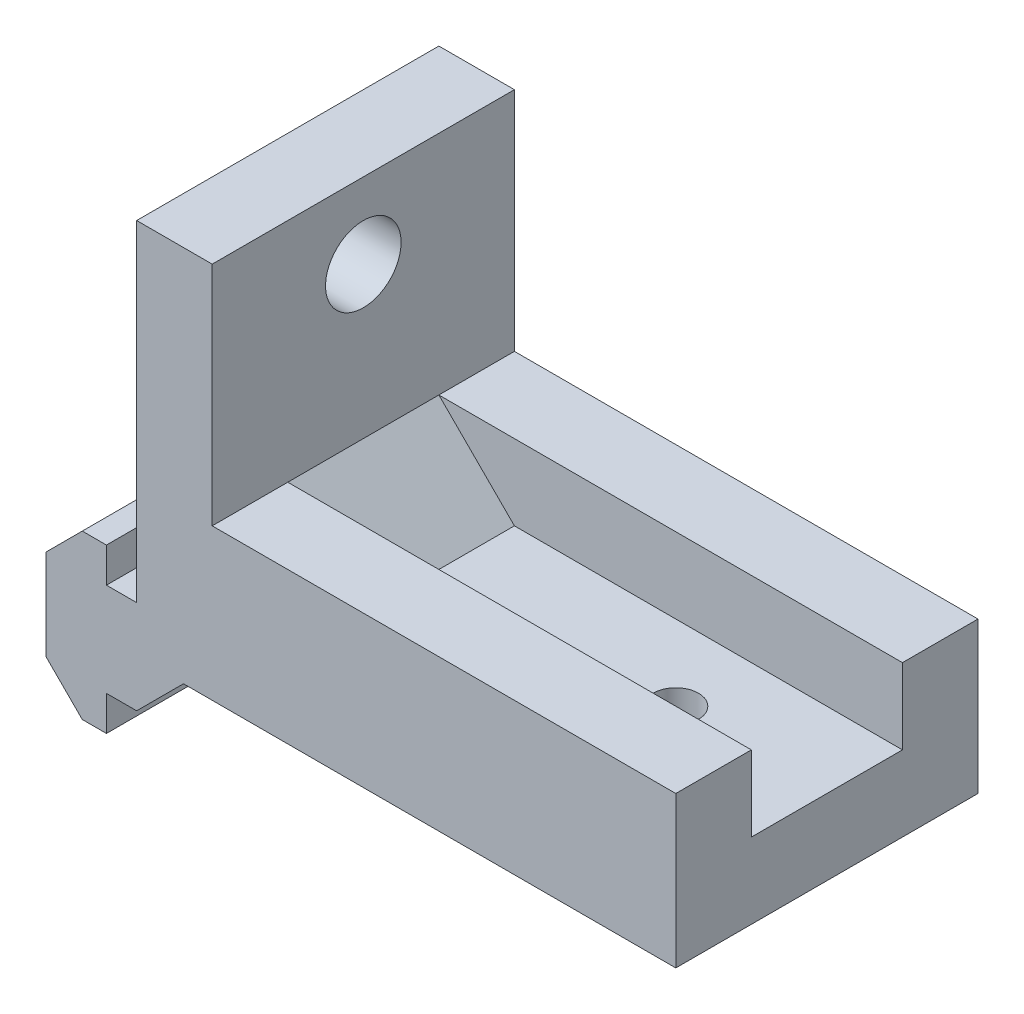
ISO-10303-21;
HEADER;
FILE_DESCRIPTION(('STEP AP214'),'2;1');
FILE_NAME('part.step','',(''),(''),'','','');
FILE_SCHEMA(('AUTOMOTIVE_DESIGN { 1 0 10303 214 1 1 1 1 }'));
ENDSEC;
DATA;
#1=APPLICATION_CONTEXT('core data for automotive mechanical design processes');
#2=APPLICATION_PROTOCOL_DEFINITION('international standard','automotive_design',2000,#1);
#3=PRODUCT_CONTEXT('',#1,'mechanical');
#4=PRODUCT('Part','Part','',(#3));
#5=PRODUCT_RELATED_PRODUCT_CATEGORY('part','',(#4));
#6=PRODUCT_DEFINITION_FORMATION('','',#4);
#7=PRODUCT_DEFINITION_CONTEXT('part definition',#1,'design');
#8=PRODUCT_DEFINITION('design','',#6,#7);
#9=PRODUCT_DEFINITION_SHAPE('','',#8);
#10=(LENGTH_UNIT() NAMED_UNIT(*) SI_UNIT(.MILLI.,.METRE.));
#11=(NAMED_UNIT(*) PLANE_ANGLE_UNIT() SI_UNIT($,.RADIAN.));
#12=(NAMED_UNIT(*) SI_UNIT($,.STERADIAN.) SOLID_ANGLE_UNIT());
#13=UNCERTAINTY_MEASURE_WITH_UNIT(LENGTH_MEASURE(1.E-05),#10,'distance_accuracy_value','');
#14=(GEOMETRIC_REPRESENTATION_CONTEXT(3) GLOBAL_UNCERTAINTY_ASSIGNED_CONTEXT((#13)) GLOBAL_UNIT_ASSIGNED_CONTEXT((#10,
#11,#12)) REPRESENTATION_CONTEXT('',''));
#15=CARTESIAN_POINT('',(0.,0.,0.));
#16=DIRECTION('',(0.,0.,1.));
#17=DIRECTION('',(1.,0.,0.));
#18=AXIS2_PLACEMENT_3D('',#15,#16,#17);
#19=CARTESIAN_POINT('',(0.,5.,0.));
#20=DIRECTION('',(1.,0.,0.));
#21=DIRECTION('',(0.,0.,-1.));
#22=AXIS2_PLACEMENT_3D('',#19,#20,#21);
#23=PLANE('',#22);
#24=CARTESIAN_POINT('',(0.,20.,0.));
#25=DIRECTION('',(1.,0.,0.));
#26=DIRECTION('',(0.,0.,-1.));
#27=AXIS2_PLACEMENT_3D('',#24,#25,#26);
#28=CIRCLE('',#27,2.5);
#29=CARTESIAN_POINT('',(0.,20.,-2.5));
#30=VERTEX_POINT('',#29);
#31=EDGE_CURVE('E260',#30,#30,#28,.T.);
#32=ORIENTED_EDGE('',*,*,#31,.T.);
#33=EDGE_LOOP('',(#32));
#34=FACE_BOUND('',#33,.T.);
#35=DIRECTION('',(0.,0.,-1.));
#36=VECTOR('',#35,1.);
#37=CARTESIAN_POINT('',(0.,3.1,22.3547561691844));
#38=LINE('',#37,#36);
#39=CARTESIAN_POINT('',(0.,3.1,10.));
#40=VERTEX_POINT('',#39);
#41=CARTESIAN_POINT('',(0.,3.1,-10.));
#42=VERTEX_POINT('',#41);
#43=EDGE_CURVE('E229',#40,#42,#38,.T.);
#44=ORIENTED_EDGE('',*,*,#43,.F.);
#45=DIRECTION('',(0.,-1.,0.));
#46=VECTOR('',#45,1.);
#47=CARTESIAN_POINT('',(0.,5.,10.));
#48=LINE('',#47,#46);
#49=CARTESIAN_POINT('',(0.,25.,10.));
#50=VERTEX_POINT('',#49);
#51=EDGE_CURVE('E480',#50,#40,#48,.T.);
#52=ORIENTED_EDGE('',*,*,#51,.F.);
#53=DIRECTION('',(0.,0.,1.));
#54=VECTOR('',#53,1.);
#55=CARTESIAN_POINT('',(0.,25.,0.));
#56=LINE('',#55,#54);
#57=CARTESIAN_POINT('',(0.,25.,-10.));
#58=VERTEX_POINT('',#57);
#59=EDGE_CURVE('E327',#58,#50,#56,.T.);
#60=ORIENTED_EDGE('',*,*,#59,.F.);
#61=DIRECTION('',(0.,-1.,0.));
#62=VECTOR('',#61,1.);
#63=CARTESIAN_POINT('',(0.,5.,-10.));
#64=LINE('',#63,#62);
#65=EDGE_CURVE('E484',#58,#42,#64,.T.);
#66=ORIENTED_EDGE('',*,*,#65,.T.);
#67=EDGE_LOOP('',(#44,#52,#60,#66));
#68=FACE_BOUND('',#67,.T.);
#69=ADVANCED_FACE('F43',(#34,#68),#23,.F.);
#70=CARTESIAN_POINT('',(0.,0.,0.));
#71=DIRECTION('',(0.,1.,0.));
#72=DIRECTION('',(0.,0.,1.));
#73=AXIS2_PLACEMENT_3D('',#70,#71,#72);
#74=PLANE('',#73);
#75=DIRECTION('',(-1.,0.,0.));
#76=VECTOR('',#75,1.);
#77=CARTESIAN_POINT('',(0.,0.,10.));
#78=LINE('',#77,#76);
#79=CARTESIAN_POINT('',(35.68,0.,10.));
#80=VERTEX_POINT('',#79);
#81=CARTESIAN_POINT('',(3.09999999999999,0.,10.));
#82=VERTEX_POINT('',#81);
#83=EDGE_CURVE('E468',#80,#82,#78,.T.);
#84=ORIENTED_EDGE('',*,*,#83,.T.);
#85=DIRECTION('',(0.,0.,-1.));
#86=VECTOR('',#85,1.);
#87=CARTESIAN_POINT('',(3.09999999999999,0.,-10.));
#88=LINE('',#87,#86);
#89=CARTESIAN_POINT('',(3.09999999999999,0.,-10.));
#90=VERTEX_POINT('',#89);
#91=EDGE_CURVE('E487',#82,#90,#88,.T.);
#92=ORIENTED_EDGE('',*,*,#91,.T.);
#93=DIRECTION('',(-1.,0.,0.));
#94=VECTOR('',#93,1.);
#95=CARTESIAN_POINT('',(0.,0.,-10.));
#96=LINE('',#95,#94);
#97=CARTESIAN_POINT('',(35.68,0.,-10.));
#98=VERTEX_POINT('',#97);
#99=EDGE_CURVE('E454',#98,#90,#96,.T.);
#100=ORIENTED_EDGE('',*,*,#99,.F.);
#101=DIRECTION('',(0.,0.,1.));
#102=VECTOR('',#101,1.);
#103=CARTESIAN_POINT('',(35.68,0.,0.));
#104=LINE('',#103,#102);
#105=EDGE_CURVE('E460',#98,#80,#104,.T.);
#106=ORIENTED_EDGE('',*,*,#105,.T.);
#107=EDGE_LOOP('',(#84,#92,#100,#106));
#108=FACE_BOUND('',#107,.T.);
#109=DIRECTION('',(1.,0.,0.));
#110=VECTOR('',#109,1.);
#111=CARTESIAN_POINT('',(0.,0.,2.75));
#112=LINE('',#111,#110);
#113=CARTESIAN_POINT('',(24.0922867597285,0.,2.75));
#114=VERTEX_POINT('',#113);
#115=CARTESIAN_POINT('',(27.2677132402715,0.,2.75));
#116=VERTEX_POINT('',#115);
#117=EDGE_CURVE('E342',#114,#116,#112,.T.);
#118=ORIENTED_EDGE('',*,*,#117,.T.);
#119=DIRECTION('',(0.5,0.,-0.866025403784439));
#120=VECTOR('',#119,1.);
#121=CARTESIAN_POINT('',(21.6415698604072,0.,12.4947661845922));
#122=LINE('',#121,#120);
#123=CARTESIAN_POINT('',(28.8554264805429,0.,0.));
#124=VERTEX_POINT('',#123);
#125=EDGE_CURVE('E371',#116,#124,#122,.T.);
#126=ORIENTED_EDGE('',*,*,#125,.T.);
#127=DIRECTION('',(-0.5,0.,-0.866025403784439));
#128=VECTOR('',#127,1.);
#129=CARTESIAN_POINT('',(21.6415698604072,0.,-12.4947661845922));
#130=LINE('',#129,#128);
#131=CARTESIAN_POINT('',(27.2677132402715,0.,-2.75));
#132=VERTEX_POINT('',#131);
#133=EDGE_CURVE('E375',#124,#132,#130,.T.);
#134=ORIENTED_EDGE('',*,*,#133,.T.);
#135=DIRECTION('',(-1.,0.,0.));
#136=VECTOR('',#135,1.);
#137=CARTESIAN_POINT('',(0.,0.,-2.75));
#138=LINE('',#137,#136);
#139=CARTESIAN_POINT('',(24.0922867597285,0.,-2.75));
#140=VERTEX_POINT('',#139);
#141=EDGE_CURVE('E379',#132,#140,#138,.T.);
#142=ORIENTED_EDGE('',*,*,#141,.T.);
#143=DIRECTION('',(-0.499999999999999,0.,0.866025403784439));
#144=VECTOR('',#143,1.);
#145=CARTESIAN_POINT('',(16.8784301395928,0.,9.74476618459219));
#146=LINE('',#145,#144);
#147=CARTESIAN_POINT('',(22.5045735194571,0.,0.));
#148=VERTEX_POINT('',#147);
#149=EDGE_CURVE('E383',#140,#148,#146,.T.);
#150=ORIENTED_EDGE('',*,*,#149,.T.);
#151=DIRECTION('',(0.5,0.,0.866025403784439));
#152=VECTOR('',#151,1.);
#153=CARTESIAN_POINT('',(16.8784301395928,0.,-9.74476618459219));
#154=LINE('',#153,#152);
#155=EDGE_CURVE('E348',#148,#114,#154,.T.);
#156=ORIENTED_EDGE('',*,*,#155,.T.);
#157=EDGE_LOOP('',(#118,#126,#134,#142,#150,#156));
#158=FACE_BOUND('',#157,.T.);
#159=ADVANCED_FACE('F532',(#108,#158),#74,.F.);
#160=CARTESIAN_POINT('',(0.,5.,0.));
#161=DIRECTION('',(0.,1.,0.));
#162=DIRECTION('',(0.,0.,1.));
#163=AXIS2_PLACEMENT_3D('',#160,#161,#162);
#164=PLANE('',#163);
#165=DIRECTION('',(1.,0.,0.));
#166=VECTOR('',#165,1.);
#167=CARTESIAN_POINT('',(0.,5.,-5.));
#168=LINE('',#167,#166);
#169=CARTESIAN_POINT('',(9.99999999999998,5.,-5.));
#170=VERTEX_POINT('',#169);
#171=CARTESIAN_POINT('',(35.68,5.,-5.));
#172=VERTEX_POINT('',#171);
#173=EDGE_CURVE('E451',#170,#172,#168,.T.);
#174=ORIENTED_EDGE('',*,*,#173,.F.);
#175=DIRECTION('',(0.,0.,1.));
#176=VECTOR('',#175,1.);
#177=CARTESIAN_POINT('',(9.99999999999999,5.,5.));
#178=LINE('',#177,#176);
#179=CARTESIAN_POINT('',(9.99999999999999,5.,5.));
#180=VERTEX_POINT('',#179);
#181=EDGE_CURVE('E53',#170,#180,#178,.T.);
#182=ORIENTED_EDGE('',*,*,#181,.T.);
#183=DIRECTION('',(1.,0.,0.));
#184=VECTOR('',#183,1.);
#185=CARTESIAN_POINT('',(0.,5.,5.));
#186=LINE('',#185,#184);
#187=CARTESIAN_POINT('',(35.68,5.,5.));
#188=VERTEX_POINT('',#187);
#189=EDGE_CURVE('E429',#180,#188,#186,.T.);
#190=ORIENTED_EDGE('',*,*,#189,.T.);
#191=DIRECTION('',(0.,0.,1.));
#192=VECTOR('',#191,1.);
#193=CARTESIAN_POINT('',(35.68,5.,0.));
#194=LINE('',#193,#192);
#195=EDGE_CURVE('E455',#172,#188,#194,.T.);
#196=ORIENTED_EDGE('',*,*,#195,.F.);
#197=EDGE_LOOP('',(#174,#182,#190,#196));
#198=FACE_BOUND('',#197,.T.);
#199=CARTESIAN_POINT('',(25.68,5.,0.));
#200=DIRECTION('',(0.,1.,0.));
#201=DIRECTION('',(0.,0.,1.));
#202=AXIS2_PLACEMENT_3D('',#199,#200,#201);
#203=CIRCLE('',#202,1.5);
#204=CARTESIAN_POINT('',(25.68,5.,1.5));
#205=VERTEX_POINT('',#204);
#206=EDGE_CURVE('E459',#205,#205,#203,.T.);
#207=ORIENTED_EDGE('',*,*,#206,.F.);
#208=EDGE_LOOP('',(#207));
#209=FACE_BOUND('',#208,.T.);
#210=ADVANCED_FACE('F517',(#198,#209),#164,.T.);
#211=CARTESIAN_POINT('',(0.,5.,-10.));
#212=DIRECTION('',(0.,0.,1.));
#213=DIRECTION('',(1.,0.,0.));
#214=AXIS2_PLACEMENT_3D('',#211,#212,#213);
#215=PLANE('',#214);
#216=ORIENTED_EDGE('',*,*,#65,.F.);
#217=DIRECTION('',(-1.,0.,0.));
#218=VECTOR('',#217,1.);
#219=CARTESIAN_POINT('',(0.,25.,-10.));
#220=LINE('',#219,#218);
#221=CARTESIAN_POINT('',(5.,25.,-10.));
#222=VERTEX_POINT('',#221);
#223=EDGE_CURVE('E323',#222,#58,#220,.T.);
#224=ORIENTED_EDGE('',*,*,#223,.F.);
#225=DIRECTION('',(0.,-1.,0.));
#226=VECTOR('',#225,1.);
#227=CARTESIAN_POINT('',(5.,25.,-10.));
#228=LINE('',#227,#226);
#229=CARTESIAN_POINT('',(5.,10.,-10.));
#230=VERTEX_POINT('',#229);
#231=EDGE_CURVE('E338',#222,#230,#228,.T.);
#232=ORIENTED_EDGE('',*,*,#231,.T.);
#233=DIRECTION('',(-1.,0.,0.));
#234=VECTOR('',#233,1.);
#235=CARTESIAN_POINT('',(0.,10.,-10.));
#236=LINE('',#235,#234);
#237=CARTESIAN_POINT('',(35.68,10.,-10.));
#238=VERTEX_POINT('',#237);
#239=EDGE_CURVE('E439',#238,#230,#236,.T.);
#240=ORIENTED_EDGE('',*,*,#239,.F.);
#241=DIRECTION('',(0.,-1.,0.));
#242=VECTOR('',#241,1.);
#243=CARTESIAN_POINT('',(35.68,5.,-10.));
#244=LINE('',#243,#242);
#245=EDGE_CURVE('E464',#238,#98,#244,.T.);
#246=ORIENTED_EDGE('',*,*,#245,.T.);
#247=ORIENTED_EDGE('',*,*,#99,.T.);
#248=DIRECTION('',(0.707106781186547,0.707106781186548,0.));
#249=VECTOR('',#248,1.);
#250=CARTESIAN_POINT('',(4.05,0.950000000000012,-10.));
#251=LINE('',#250,#249);
#252=CARTESIAN_POINT('',(0.,-3.1,-10.));
#253=VERTEX_POINT('',#252);
#254=EDGE_CURVE('E493',#90,#253,#251,.F.);
#255=ORIENTED_EDGE('',*,*,#254,.T.);
#256=DIRECTION('',(-1.,0.,0.));
#257=VECTOR('',#256,1.);
#258=CARTESIAN_POINT('',(-2.,-3.1,-10.));
#259=LINE('',#258,#257);
#260=CARTESIAN_POINT('',(-2.,-3.1,-10.));
#261=VERTEX_POINT('',#260);
#262=EDGE_CURVE('E245',#253,#261,#259,.T.);
#263=ORIENTED_EDGE('',*,*,#262,.T.);
#264=DIRECTION('',(0.,-1.,0.));
#265=VECTOR('',#264,1.);
#266=CARTESIAN_POINT('',(-2.,-5.4,-10.));
#267=LINE('',#266,#265);
#268=CARTESIAN_POINT('',(-2.,-5.4,-10.));
#269=VERTEX_POINT('',#268);
#270=EDGE_CURVE('E252',#261,#269,#267,.T.);
#271=ORIENTED_EDGE('',*,*,#270,.T.);
#272=DIRECTION('',(-1.,0.,0.));
#273=VECTOR('',#272,1.);
#274=CARTESIAN_POINT('',(-3.6,-5.4,-10.));
#275=LINE('',#274,#273);
#276=CARTESIAN_POINT('',(-3.6,-5.4,-10.));
#277=VERTEX_POINT('',#276);
#278=EDGE_CURVE('E551',#269,#277,#275,.T.);
#279=ORIENTED_EDGE('',*,*,#278,.T.);
#280=DIRECTION('',(-0.707106781186548,0.707106781186548,0.));
#281=VECTOR('',#280,1.);
#282=CARTESIAN_POINT('',(-6.,-3.,-10.));
#283=LINE('',#282,#281);
#284=CARTESIAN_POINT('',(-6.,-3.,-10.));
#285=VERTEX_POINT('',#284);
#286=EDGE_CURVE('E553',#277,#285,#283,.T.);
#287=ORIENTED_EDGE('',*,*,#286,.T.);
#288=DIRECTION('',(0.,1.,0.));
#289=VECTOR('',#288,1.);
#290=CARTESIAN_POINT('',(-6.,3.,-10.));
#291=LINE('',#290,#289);
#292=CARTESIAN_POINT('',(-6.,3.,-10.));
#293=VERTEX_POINT('',#292);
#294=EDGE_CURVE('E559',#285,#293,#291,.T.);
#295=ORIENTED_EDGE('',*,*,#294,.T.);
#296=DIRECTION('',(0.707106781186548,0.707106781186548,0.));
#297=VECTOR('',#296,1.);
#298=CARTESIAN_POINT('',(-3.6,5.4,-10.));
#299=LINE('',#298,#297);
#300=CARTESIAN_POINT('',(-3.6,5.4,-10.));
#301=VERTEX_POINT('',#300);
#302=EDGE_CURVE('E563',#293,#301,#299,.T.);
#303=ORIENTED_EDGE('',*,*,#302,.T.);
#304=DIRECTION('',(1.,0.,0.));
#305=VECTOR('',#304,1.);
#306=CARTESIAN_POINT('',(-2.,5.4,-10.));
#307=LINE('',#306,#305);
#308=CARTESIAN_POINT('',(-2.,5.4,-10.));
#309=VERTEX_POINT('',#308);
#310=EDGE_CURVE('E238',#301,#309,#307,.T.);
#311=ORIENTED_EDGE('',*,*,#310,.T.);
#312=DIRECTION('',(0.,-1.,0.));
#313=VECTOR('',#312,1.);
#314=CARTESIAN_POINT('',(-2.,3.1,-10.));
#315=LINE('',#314,#313);
#316=CARTESIAN_POINT('',(-2.,3.1,-10.));
#317=VERTEX_POINT('',#316);
#318=EDGE_CURVE('E220',#309,#317,#315,.T.);
#319=ORIENTED_EDGE('',*,*,#318,.T.);
#320=DIRECTION('',(1.,0.,0.));
#321=VECTOR('',#320,1.);
#322=CARTESIAN_POINT('',(0.,3.1,-10.));
#323=LINE('',#322,#321);
#324=EDGE_CURVE('E235',#317,#42,#323,.T.);
#325=ORIENTED_EDGE('',*,*,#324,.T.);
#326=EDGE_LOOP('',(#216,#224,#232,#240,#246,#247,#255,#263,#271,#279,#287,#295,#303,#311,#319,#325));
#327=FACE_BOUND('',#326,.T.);
#328=ADVANCED_FACE('F234',(#327),#215,.F.);
#329=CARTESIAN_POINT('',(0.,5.,10.));
#330=DIRECTION('',(0.,0.,1.));
#331=DIRECTION('',(1.,0.,0.));
#332=AXIS2_PLACEMENT_3D('',#329,#330,#331);
#333=PLANE('',#332);
#334=DIRECTION('',(-1.,0.,0.));
#335=VECTOR('',#334,1.);
#336=CARTESIAN_POINT('',(0.,25.,10.));
#337=LINE('',#336,#335);
#338=CARTESIAN_POINT('',(5.,25.,10.));
#339=VERTEX_POINT('',#338);
#340=EDGE_CURVE('E331',#339,#50,#337,.T.);
#341=ORIENTED_EDGE('',*,*,#340,.T.);
#342=ORIENTED_EDGE('',*,*,#51,.T.);
#343=DIRECTION('',(-1.,0.,0.));
#344=VECTOR('',#343,1.);
#345=CARTESIAN_POINT('',(0.,3.1,10.));
#346=LINE('',#345,#344);
#347=CARTESIAN_POINT('',(-2.,3.1,10.));
#348=VERTEX_POINT('',#347);
#349=EDGE_CURVE('E283',#40,#348,#346,.T.);
#350=ORIENTED_EDGE('',*,*,#349,.T.);
#351=DIRECTION('',(0.,1.,0.));
#352=VECTOR('',#351,1.);
#353=CARTESIAN_POINT('',(-2.,3.1,10.));
#354=LINE('',#353,#352);
#355=CARTESIAN_POINT('',(-2.,5.4,10.));
#356=VERTEX_POINT('',#355);
#357=EDGE_CURVE('E222',#348,#356,#354,.T.);
#358=ORIENTED_EDGE('',*,*,#357,.T.);
#359=DIRECTION('',(-1.,0.,0.));
#360=VECTOR('',#359,1.);
#361=CARTESIAN_POINT('',(-2.,5.4,10.));
#362=LINE('',#361,#360);
#363=CARTESIAN_POINT('',(-3.6,5.4,10.));
#364=VERTEX_POINT('',#363);
#365=EDGE_CURVE('E277',#356,#364,#362,.T.);
#366=ORIENTED_EDGE('',*,*,#365,.T.);
#367=DIRECTION('',(-0.707106781186548,-0.707106781186548,0.));
#368=VECTOR('',#367,1.);
#369=CARTESIAN_POINT('',(-3.6,5.4,10.));
#370=LINE('',#369,#368);
#371=CARTESIAN_POINT('',(-6.,3.,10.));
#372=VERTEX_POINT('',#371);
#373=EDGE_CURVE('E273',#364,#372,#370,.T.);
#374=ORIENTED_EDGE('',*,*,#373,.T.);
#375=DIRECTION('',(0.,-1.,0.));
#376=VECTOR('',#375,1.);
#377=CARTESIAN_POINT('',(-6.,3.,10.));
#378=LINE('',#377,#376);
#379=CARTESIAN_POINT('',(-6.,-3.,10.));
#380=VERTEX_POINT('',#379);
#381=EDGE_CURVE('E269',#372,#380,#378,.T.);
#382=ORIENTED_EDGE('',*,*,#381,.T.);
#383=DIRECTION('',(0.707106781186548,-0.707106781186548,0.));
#384=VECTOR('',#383,1.);
#385=CARTESIAN_POINT('',(-6.,-3.,10.));
#386=LINE('',#385,#384);
#387=CARTESIAN_POINT('',(-3.6,-5.4,10.));
#388=VERTEX_POINT('',#387);
#389=EDGE_CURVE('E265',#380,#388,#386,.T.);
#390=ORIENTED_EDGE('',*,*,#389,.T.);
#391=DIRECTION('',(1.,0.,0.));
#392=VECTOR('',#391,1.);
#393=CARTESIAN_POINT('',(-3.6,-5.4,10.));
#394=LINE('',#393,#392);
#395=CARTESIAN_POINT('',(-2.,-5.4,10.));
#396=VERTEX_POINT('',#395);
#397=EDGE_CURVE('E261',#388,#396,#394,.T.);
#398=ORIENTED_EDGE('',*,*,#397,.T.);
#399=DIRECTION('',(0.,1.,0.));
#400=VECTOR('',#399,1.);
#401=CARTESIAN_POINT('',(-2.,-5.4,10.));
#402=LINE('',#401,#400);
#403=CARTESIAN_POINT('',(-2.,-3.1,10.));
#404=VERTEX_POINT('',#403);
#405=EDGE_CURVE('E256',#396,#404,#402,.T.);
#406=ORIENTED_EDGE('',*,*,#405,.T.);
#407=DIRECTION('',(1.,0.,0.));
#408=VECTOR('',#407,1.);
#409=CARTESIAN_POINT('',(-2.,-3.1,10.));
#410=LINE('',#409,#408);
#411=CARTESIAN_POINT('',(0.,-3.1,10.));
#412=VERTEX_POINT('',#411);
#413=EDGE_CURVE('E286',#404,#412,#410,.T.);
#414=ORIENTED_EDGE('',*,*,#413,.T.);
#415=DIRECTION('',(-0.707106781186547,-0.707106781186548,0.));
#416=VECTOR('',#415,1.);
#417=CARTESIAN_POINT('',(0.,-3.1,10.));
#418=LINE('',#417,#416);
#419=EDGE_CURVE('E490',#412,#82,#418,.F.);
#420=ORIENTED_EDGE('',*,*,#419,.T.);
#421=ORIENTED_EDGE('',*,*,#83,.F.);
#422=DIRECTION('',(0.,-1.,0.));
#423=VECTOR('',#422,1.);
#424=CARTESIAN_POINT('',(35.68,5.,10.));
#425=LINE('',#424,#423);
#426=CARTESIAN_POINT('',(35.68,10.,10.));
#427=VERTEX_POINT('',#426);
#428=EDGE_CURVE('E476',#427,#80,#425,.T.);
#429=ORIENTED_EDGE('',*,*,#428,.F.);
#430=DIRECTION('',(-1.,0.,0.));
#431=VECTOR('',#430,1.);
#432=CARTESIAN_POINT('',(0.,10.,10.));
#433=LINE('',#432,#431);
#434=CARTESIAN_POINT('',(5.,10.,10.));
#435=VERTEX_POINT('',#434);
#436=EDGE_CURVE('E417',#427,#435,#433,.T.);
#437=ORIENTED_EDGE('',*,*,#436,.T.);
#438=DIRECTION('',(0.,-1.,0.));
#439=VECTOR('',#438,1.);
#440=CARTESIAN_POINT('',(5.,25.,10.));
#441=LINE('',#440,#439);
#442=EDGE_CURVE('E335',#339,#435,#441,.T.);
#443=ORIENTED_EDGE('',*,*,#442,.F.);
#444=EDGE_LOOP('',(#341,#342,#350,#358,#366,#374,#382,#390,#398,#406,#414,#420,#421,#429,#437,#443));
#445=FACE_BOUND('',#444,.T.);
#446=ADVANCED_FACE('F529',(#445),#333,.T.);
#447=CARTESIAN_POINT('',(35.68,5.,0.));
#448=DIRECTION('',(1.,0.,0.));
#449=DIRECTION('',(0.,0.,-1.));
#450=AXIS2_PLACEMENT_3D('',#447,#448,#449);
#451=PLANE('',#450);
#452=ORIENTED_EDGE('',*,*,#428,.T.);
#453=ORIENTED_EDGE('',*,*,#105,.F.);
#454=ORIENTED_EDGE('',*,*,#245,.F.);
#455=DIRECTION('',(0.,0.,1.));
#456=VECTOR('',#455,1.);
#457=CARTESIAN_POINT('',(35.68,10.,0.));
#458=LINE('',#457,#456);
#459=CARTESIAN_POINT('',(35.68,10.,-5.));
#460=VERTEX_POINT('',#459);
#461=EDGE_CURVE('E435',#238,#460,#458,.T.);
#462=ORIENTED_EDGE('',*,*,#461,.T.);
#463=DIRECTION('',(0.,-1.,0.));
#464=VECTOR('',#463,1.);
#465=CARTESIAN_POINT('',(35.68,10.,-5.));
#466=LINE('',#465,#464);
#467=EDGE_CURVE('E447',#460,#172,#466,.T.);
#468=ORIENTED_EDGE('',*,*,#467,.T.);
#469=ORIENTED_EDGE('',*,*,#195,.T.);
#470=DIRECTION('',(0.,-1.,0.));
#471=VECTOR('',#470,1.);
#472=CARTESIAN_POINT('',(35.68,10.,5.));
#473=LINE('',#472,#471);
#474=CARTESIAN_POINT('',(35.68,10.,5.));
#475=VERTEX_POINT('',#474);
#476=EDGE_CURVE('E425',#475,#188,#473,.T.);
#477=ORIENTED_EDGE('',*,*,#476,.F.);
#478=DIRECTION('',(0.,0.,1.));
#479=VECTOR('',#478,1.);
#480=CARTESIAN_POINT('',(35.68,10.,0.));
#481=LINE('',#480,#479);
#482=EDGE_CURVE('E421',#475,#427,#481,.T.);
#483=ORIENTED_EDGE('',*,*,#482,.T.);
#484=EDGE_LOOP('',(#452,#453,#454,#462,#468,#469,#477,#483));
#485=FACE_BOUND('',#484,.T.);
#486=ADVANCED_FACE('F516',(#485),#451,.T.);
#487=CARTESIAN_POINT('',(25.68,5.,0.));
#488=DIRECTION('',(0.,-1.,0.));
#489=DIRECTION('',(0.,0.,-1.));
#490=AXIS2_PLACEMENT_3D('',#487,#488,#489);
#491=CYLINDRICAL_SURFACE('',#490,1.5);
#492=CARTESIAN_POINT('',(25.68,1.5,0.));
#493=DIRECTION('',(0.,1.,0.));
#494=DIRECTION('',(0.,0.,1.));
#495=AXIS2_PLACEMENT_3D('',#492,#493,#494);
#496=CIRCLE('',#495,1.5);
#497=CARTESIAN_POINT('',(25.68,1.5,1.5));
#498=VERTEX_POINT('',#497);
#499=EDGE_CURVE('E343',#498,#498,#496,.T.);
#500=ORIENTED_EDGE('',*,*,#499,.F.);
#501=EDGE_LOOP('',(#500));
#502=FACE_BOUND('',#501,.T.);
#503=ORIENTED_EDGE('',*,*,#206,.T.);
#504=EDGE_LOOP('',(#503));
#505=FACE_BOUND('',#504,.T.);
#506=ADVANCED_FACE('F723',(#502,#505),#491,.F.);
#507=CARTESIAN_POINT('',(0.,10.,-5.));
#508=DIRECTION('',(0.,0.,1.));
#509=DIRECTION('',(1.,0.,0.));
#510=AXIS2_PLACEMENT_3D('',#507,#508,#509);
#511=PLANE('',#510);
#512=DIRECTION('',(-1.,0.,0.));
#513=VECTOR('',#512,1.);
#514=CARTESIAN_POINT('',(0.,10.,-5.));
#515=LINE('',#514,#513);
#516=CARTESIAN_POINT('',(5.,10.,-5.));
#517=VERTEX_POINT('',#516);
#518=EDGE_CURVE('E432',#460,#517,#515,.T.);
#519=ORIENTED_EDGE('',*,*,#518,.T.);
#520=DIRECTION('',(-0.707106781186544,0.707106781186551,0.));
#521=VECTOR('',#520,1.);
#522=CARTESIAN_POINT('',(2.50000000000004,12.5,-5.));
#523=LINE('',#522,#521);
#524=EDGE_CURVE('E67',#517,#170,#523,.F.);
#525=ORIENTED_EDGE('',*,*,#524,.T.);
#526=ORIENTED_EDGE('',*,*,#173,.T.);
#527=ORIENTED_EDGE('',*,*,#467,.F.);
#528=EDGE_LOOP('',(#519,#525,#526,#527));
#529=FACE_BOUND('',#528,.T.);
#530=ADVANCED_FACE('F513',(#529),#511,.T.);
#531=CARTESIAN_POINT('',(0.,10.,0.));
#532=DIRECTION('',(0.,1.,0.));
#533=DIRECTION('',(0.,0.,1.));
#534=AXIS2_PLACEMENT_3D('',#531,#532,#533);
#535=PLANE('',#534);
#536=ORIENTED_EDGE('',*,*,#518,.F.);
#537=ORIENTED_EDGE('',*,*,#461,.F.);
#538=ORIENTED_EDGE('',*,*,#239,.T.);
#539=DIRECTION('',(0.,0.,1.));
#540=VECTOR('',#539,1.);
#541=CARTESIAN_POINT('',(5.,10.,0.));
#542=LINE('',#541,#540);
#543=EDGE_CURVE('E443',#230,#517,#542,.T.);
#544=ORIENTED_EDGE('',*,*,#543,.T.);
#545=EDGE_LOOP('',(#536,#537,#538,#544));
#546=FACE_BOUND('',#545,.T.);
#547=ADVANCED_FACE('F510',(#546),#535,.T.);
#548=CARTESIAN_POINT('',(0.,10.,5.));
#549=DIRECTION('',(0.,0.,1.));
#550=DIRECTION('',(1.,0.,0.));
#551=AXIS2_PLACEMENT_3D('',#548,#549,#550);
#552=PLANE('',#551);
#553=ORIENTED_EDGE('',*,*,#189,.F.);
#554=DIRECTION('',(0.707106781186544,-0.707106781186551,0.));
#555=VECTOR('',#554,1.);
#556=CARTESIAN_POINT('',(5.,10.,5.));
#557=LINE('',#556,#555);
#558=CARTESIAN_POINT('',(5.,10.,5.));
#559=VERTEX_POINT('',#558);
#560=EDGE_CURVE('E11',#180,#559,#557,.F.);
#561=ORIENTED_EDGE('',*,*,#560,.T.);
#562=DIRECTION('',(-1.,0.,0.));
#563=VECTOR('',#562,1.);
#564=CARTESIAN_POINT('',(0.,10.,5.));
#565=LINE('',#564,#563);
#566=EDGE_CURVE('E409',#475,#559,#565,.T.);
#567=ORIENTED_EDGE('',*,*,#566,.F.);
#568=ORIENTED_EDGE('',*,*,#476,.T.);
#569=EDGE_LOOP('',(#553,#561,#567,#568));
#570=FACE_BOUND('',#569,.T.);
#571=ADVANCED_FACE('F521',(#570),#552,.F.);
#572=CARTESIAN_POINT('',(0.,10.,0.));
#573=DIRECTION('',(0.,1.,0.));
#574=DIRECTION('',(0.,0.,1.));
#575=AXIS2_PLACEMENT_3D('',#572,#573,#574);
#576=PLANE('',#575);
#577=ORIENTED_EDGE('',*,*,#566,.T.);
#578=DIRECTION('',(0.,0.,1.));
#579=VECTOR('',#578,1.);
#580=CARTESIAN_POINT('',(5.,10.,0.));
#581=LINE('',#580,#579);
#582=EDGE_CURVE('E413',#559,#435,#581,.T.);
#583=ORIENTED_EDGE('',*,*,#582,.T.);
#584=ORIENTED_EDGE('',*,*,#436,.F.);
#585=ORIENTED_EDGE('',*,*,#482,.F.);
#586=EDGE_LOOP('',(#577,#583,#584,#585));
#587=FACE_BOUND('',#586,.T.);
#588=ADVANCED_FACE('F527',(#587),#576,.T.);
#589=CARTESIAN_POINT('',(0.,1.5,2.75));
#590=DIRECTION('',(0.,0.,-1.));
#591=DIRECTION('',(-1.,0.,0.));
#592=AXIS2_PLACEMENT_3D('',#589,#590,#591);
#593=PLANE('',#592);
#594=ORIENTED_EDGE('',*,*,#117,.F.);
#595=DIRECTION('',(0.,-1.,0.));
#596=VECTOR('',#595,1.);
#597=CARTESIAN_POINT('',(24.0922867597285,1.5,2.75));
#598=LINE('',#597,#596);
#599=CARTESIAN_POINT('',(24.0922867597285,1.5,2.75));
#600=VERTEX_POINT('',#599);
#601=EDGE_CURVE('E367',#600,#114,#598,.T.);
#602=ORIENTED_EDGE('',*,*,#601,.F.);
#603=DIRECTION('',(1.,0.,0.));
#604=VECTOR('',#603,1.);
#605=CARTESIAN_POINT('',(0.,1.5,2.75));
#606=LINE('',#605,#604);
#607=CARTESIAN_POINT('',(27.2677132402715,1.5,2.75));
#608=VERTEX_POINT('',#607);
#609=EDGE_CURVE('E347',#600,#608,#606,.T.);
#610=ORIENTED_EDGE('',*,*,#609,.T.);
#611=DIRECTION('',(0.,-1.,0.));
#612=VECTOR('',#611,1.);
#613=CARTESIAN_POINT('',(27.2677132402715,1.5,2.75));
#614=LINE('',#613,#612);
#615=EDGE_CURVE('E405',#608,#116,#614,.T.);
#616=ORIENTED_EDGE('',*,*,#615,.T.);
#617=EDGE_LOOP('',(#594,#602,#610,#616));
#618=FACE_BOUND('',#617,.T.);
#619=ADVANCED_FACE('F751',(#618),#593,.T.);
#620=CARTESIAN_POINT('',(21.6415698604072,1.5,12.4947661845922));
#621=DIRECTION('',(-0.866025403784439,0.,-0.5));
#622=DIRECTION('',(-0.5,0.,0.866025403784439));
#623=AXIS2_PLACEMENT_3D('',#620,#621,#622);
#624=PLANE('',#623);
#625=ORIENTED_EDGE('',*,*,#125,.F.);
#626=ORIENTED_EDGE('',*,*,#615,.F.);
#627=DIRECTION('',(0.5,0.,-0.866025403784439));
#628=VECTOR('',#627,1.);
#629=CARTESIAN_POINT('',(21.6415698604072,1.5,12.4947661845922));
#630=LINE('',#629,#628);
#631=CARTESIAN_POINT('',(28.8554264805429,1.5,0.));
#632=VERTEX_POINT('',#631);
#633=EDGE_CURVE('E352',#608,#632,#630,.T.);
#634=ORIENTED_EDGE('',*,*,#633,.T.);
#635=DIRECTION('',(0.,-1.,0.));
#636=VECTOR('',#635,1.);
#637=CARTESIAN_POINT('',(28.8554264805429,1.5,0.));
#638=LINE('',#637,#636);
#639=EDGE_CURVE('E402',#632,#124,#638,.T.);
#640=ORIENTED_EDGE('',*,*,#639,.T.);
#641=EDGE_LOOP('',(#625,#626,#634,#640));
#642=FACE_BOUND('',#641,.T.);
#643=ADVANCED_FACE('F805',(#642),#624,.T.);
#644=CARTESIAN_POINT('',(21.6415698604072,1.5,-12.4947661845922));
#645=DIRECTION('',(-0.866025403784439,0.,0.5));
#646=DIRECTION('',(0.5,0.,0.866025403784439));
#647=AXIS2_PLACEMENT_3D('',#644,#645,#646);
#648=PLANE('',#647);
#649=ORIENTED_EDGE('',*,*,#133,.F.);
#650=ORIENTED_EDGE('',*,*,#639,.F.);
#651=DIRECTION('',(-0.5,0.,-0.866025403784439));
#652=VECTOR('',#651,1.);
#653=CARTESIAN_POINT('',(21.6415698604072,1.5,-12.4947661845922));
#654=LINE('',#653,#652);
#655=CARTESIAN_POINT('',(27.2677132402715,1.5,-2.75));
#656=VERTEX_POINT('',#655);
#657=EDGE_CURVE('E355',#632,#656,#654,.T.);
#658=ORIENTED_EDGE('',*,*,#657,.T.);
#659=DIRECTION('',(0.,-1.,0.));
#660=VECTOR('',#659,1.);
#661=CARTESIAN_POINT('',(27.2677132402715,1.5,-2.75));
#662=LINE('',#661,#660);
#663=EDGE_CURVE('E399',#656,#132,#662,.T.);
#664=ORIENTED_EDGE('',*,*,#663,.T.);
#665=EDGE_LOOP('',(#649,#650,#658,#664));
#666=FACE_BOUND('',#665,.T.);
#667=ADVANCED_FACE('F797',(#666),#648,.T.);
#668=CARTESIAN_POINT('',(0.,1.5,-2.75));
#669=DIRECTION('',(0.,0.,1.));
#670=DIRECTION('',(1.,0.,0.));
#671=AXIS2_PLACEMENT_3D('',#668,#669,#670);
#672=PLANE('',#671);
#673=ORIENTED_EDGE('',*,*,#141,.F.);
#674=ORIENTED_EDGE('',*,*,#663,.F.);
#675=DIRECTION('',(-1.,0.,0.));
#676=VECTOR('',#675,1.);
#677=CARTESIAN_POINT('',(0.,1.5,-2.75));
#678=LINE('',#677,#676);
#679=CARTESIAN_POINT('',(24.0922867597285,1.5,-2.75));
#680=VERTEX_POINT('',#679);
#681=EDGE_CURVE('E358',#656,#680,#678,.T.);
#682=ORIENTED_EDGE('',*,*,#681,.T.);
#683=DIRECTION('',(0.,-1.,0.));
#684=VECTOR('',#683,1.);
#685=CARTESIAN_POINT('',(24.0922867597285,1.5,-2.75));
#686=LINE('',#685,#684);
#687=EDGE_CURVE('E396',#680,#140,#686,.T.);
#688=ORIENTED_EDGE('',*,*,#687,.T.);
#689=EDGE_LOOP('',(#673,#674,#682,#688));
#690=FACE_BOUND('',#689,.T.);
#691=ADVANCED_FACE('F789',(#690),#672,.T.);
#692=CARTESIAN_POINT('',(16.8784301395928,1.5,9.74476618459219));
#693=DIRECTION('',(0.866025403784439,0.,0.499999999999999));
#694=DIRECTION('',(0.499999999999999,0.,-0.866025403784439));
#695=AXIS2_PLACEMENT_3D('',#692,#693,#694);
#696=PLANE('',#695);
#697=ORIENTED_EDGE('',*,*,#149,.F.);
#698=ORIENTED_EDGE('',*,*,#687,.F.);
#699=DIRECTION('',(-0.499999999999999,0.,0.866025403784439));
#700=VECTOR('',#699,1.);
#701=CARTESIAN_POINT('',(16.8784301395928,1.5,9.74476618459219));
#702=LINE('',#701,#700);
#703=CARTESIAN_POINT('',(22.5045735194571,1.5,0.));
#704=VERTEX_POINT('',#703);
#705=EDGE_CURVE('E361',#680,#704,#702,.T.);
#706=ORIENTED_EDGE('',*,*,#705,.T.);
#707=DIRECTION('',(0.,-1.,0.));
#708=VECTOR('',#707,1.);
#709=CARTESIAN_POINT('',(22.5045735194571,1.5,0.));
#710=LINE('',#709,#708);
#711=EDGE_CURVE('E393',#704,#148,#710,.T.);
#712=ORIENTED_EDGE('',*,*,#711,.T.);
#713=EDGE_LOOP('',(#697,#698,#706,#712));
#714=FACE_BOUND('',#713,.T.);
#715=ADVANCED_FACE('F781',(#714),#696,.T.);
#716=CARTESIAN_POINT('',(16.8784301395928,1.5,-9.74476618459219));
#717=DIRECTION('',(0.866025403784439,0.,-0.5));
#718=DIRECTION('',(-0.5,0.,-0.866025403784439));
#719=AXIS2_PLACEMENT_3D('',#716,#717,#718);
#720=PLANE('',#719);
#721=ORIENTED_EDGE('',*,*,#155,.F.);
#722=ORIENTED_EDGE('',*,*,#711,.F.);
#723=DIRECTION('',(0.5,0.,0.866025403784439));
#724=VECTOR('',#723,1.);
#725=CARTESIAN_POINT('',(16.8784301395928,1.5,-9.74476618459219));
#726=LINE('',#725,#724);
#727=EDGE_CURVE('E364',#704,#600,#726,.T.);
#728=ORIENTED_EDGE('',*,*,#727,.T.);
#729=ORIENTED_EDGE('',*,*,#601,.T.);
#730=EDGE_LOOP('',(#721,#722,#728,#729));
#731=FACE_BOUND('',#730,.T.);
#732=ADVANCED_FACE('F773',(#731),#720,.T.);
#733=CARTESIAN_POINT('',(0.,1.5,0.));
#734=DIRECTION('',(0.,1.,0.));
#735=DIRECTION('',(0.,0.,1.));
#736=AXIS2_PLACEMENT_3D('',#733,#734,#735);
#737=PLANE('',#736);
#738=ORIENTED_EDGE('',*,*,#499,.T.);
#739=EDGE_LOOP('',(#738));
#740=FACE_BOUND('',#739,.T.);
#741=ORIENTED_EDGE('',*,*,#609,.F.);
#742=ORIENTED_EDGE('',*,*,#727,.F.);
#743=ORIENTED_EDGE('',*,*,#705,.F.);
#744=ORIENTED_EDGE('',*,*,#681,.F.);
#745=ORIENTED_EDGE('',*,*,#657,.F.);
#746=ORIENTED_EDGE('',*,*,#633,.F.);
#747=EDGE_LOOP('',(#741,#742,#743,#744,#745,#746));
#748=FACE_BOUND('',#747,.T.);
#749=ADVANCED_FACE('F590',(#740,#748),#737,.F.);
#750=CARTESIAN_POINT('',(5.,25.,0.));
#751=DIRECTION('',(1.,0.,0.));
#752=DIRECTION('',(0.,0.,-1.));
#753=AXIS2_PLACEMENT_3D('',#750,#751,#752);
#754=PLANE('',#753);
#755=CARTESIAN_POINT('',(5.,20.,0.));
#756=DIRECTION('',(1.,0.,0.));
#757=DIRECTION('',(0.,0.,-1.));
#758=AXIS2_PLACEMENT_3D('',#755,#756,#757);
#759=CIRCLE('',#758,2.5);
#760=CARTESIAN_POINT('',(5.,20.,-2.5));
#761=VERTEX_POINT('',#760);
#762=EDGE_CURVE('E315',#761,#761,#759,.T.);
#763=ORIENTED_EDGE('',*,*,#762,.F.);
#764=EDGE_LOOP('',(#763));
#765=FACE_BOUND('',#764,.T.);
#766=ORIENTED_EDGE('',*,*,#582,.F.);
#767=DIRECTION('',(0.,0.,-1.));
#768=VECTOR('',#767,1.);
#769=CARTESIAN_POINT('',(5.,10.,-5.));
#770=LINE('',#769,#768);
#771=EDGE_CURVE('E496',#559,#517,#770,.T.);
#772=ORIENTED_EDGE('',*,*,#771,.T.);
#773=ORIENTED_EDGE('',*,*,#543,.F.);
#774=ORIENTED_EDGE('',*,*,#231,.F.);
#775=DIRECTION('',(0.,0.,1.));
#776=VECTOR('',#775,1.);
#777=CARTESIAN_POINT('',(5.,25.,0.));
#778=LINE('',#777,#776);
#779=EDGE_CURVE('E319',#222,#339,#778,.T.);
#780=ORIENTED_EDGE('',*,*,#779,.T.);
#781=ORIENTED_EDGE('',*,*,#442,.T.);
#782=EDGE_LOOP('',(#766,#772,#773,#774,#780,#781));
#783=FACE_BOUND('',#782,.T.);
#784=ADVANCED_FACE('F505',(#765,#783),#754,.T.);
#785=CARTESIAN_POINT('',(0.,25.,0.));
#786=DIRECTION('',(0.,1.,0.));
#787=DIRECTION('',(0.,0.,1.));
#788=AXIS2_PLACEMENT_3D('',#785,#786,#787);
#789=PLANE('',#788);
#790=ORIENTED_EDGE('',*,*,#779,.F.);
#791=ORIENTED_EDGE('',*,*,#223,.T.);
#792=ORIENTED_EDGE('',*,*,#59,.T.);
#793=ORIENTED_EDGE('',*,*,#340,.F.);
#794=EDGE_LOOP('',(#790,#791,#792,#793));
#795=FACE_BOUND('',#794,.T.);
#796=ADVANCED_FACE('F579',(#795),#789,.T.);
#797=CARTESIAN_POINT('',(35.681,20.,0.));
#798=DIRECTION('',(-1.,0.,0.));
#799=DIRECTION('',(0.,0.,1.));
#800=AXIS2_PLACEMENT_3D('',#797,#798,#799);
#801=CYLINDRICAL_SURFACE('',#800,2.5);
#802=ORIENTED_EDGE('',*,*,#762,.T.);
#803=EDGE_LOOP('',(#802));
#804=FACE_BOUND('',#803,.T.);
#805=ORIENTED_EDGE('',*,*,#31,.F.);
#806=EDGE_LOOP('',(#805));
#807=FACE_BOUND('',#806,.T.);
#808=ADVANCED_FACE('F582',(#804,#807),#801,.F.);
#809=CARTESIAN_POINT('',(0.,3.1,22.3547561691844));
#810=DIRECTION('',(0.,-1.,0.));
#811=DIRECTION('',(1.,0.,0.));
#812=AXIS2_PLACEMENT_3D('',#809,#810,#811);
#813=PLANE('',#812);
#814=ORIENTED_EDGE('',*,*,#349,.F.);
#815=ORIENTED_EDGE('',*,*,#43,.T.);
#816=ORIENTED_EDGE('',*,*,#324,.F.);
#817=DIRECTION('',(0.,0.,-1.));
#818=VECTOR('',#817,1.);
#819=CARTESIAN_POINT('',(-2.,3.1,22.3547561691844));
#820=LINE('',#819,#818);
#821=EDGE_CURVE('E216',#348,#317,#820,.T.);
#822=ORIENTED_EDGE('',*,*,#821,.F.);
#823=EDGE_LOOP('',(#814,#815,#816,#822));
#824=FACE_BOUND('',#823,.T.);
#825=ADVANCED_FACE('F242',(#824),#813,.F.);
#826=CARTESIAN_POINT('',(-2.,3.1,22.3547561691844));
#827=DIRECTION('',(-1.,0.,0.));
#828=DIRECTION('',(0.,-1.,0.));
#829=AXIS2_PLACEMENT_3D('',#826,#827,#828);
#830=PLANE('',#829);
#831=ORIENTED_EDGE('',*,*,#357,.F.);
#832=ORIENTED_EDGE('',*,*,#821,.T.);
#833=ORIENTED_EDGE('',*,*,#318,.F.);
#834=DIRECTION('',(0.,0.,-1.));
#835=VECTOR('',#834,1.);
#836=CARTESIAN_POINT('',(-2.,5.4,22.3547561691844));
#837=LINE('',#836,#835);
#838=EDGE_CURVE('E228',#356,#309,#837,.T.);
#839=ORIENTED_EDGE('',*,*,#838,.F.);
#840=EDGE_LOOP('',(#831,#832,#833,#839));
#841=FACE_BOUND('',#840,.T.);
#842=ADVANCED_FACE('F218',(#841),#830,.F.);
#843=CARTESIAN_POINT('',(-2.,5.4,22.3547561691844));
#844=DIRECTION('',(0.,-1.,0.));
#845=DIRECTION('',(1.,0.,0.));
#846=AXIS2_PLACEMENT_3D('',#843,#844,#845);
#847=PLANE('',#846);
#848=ORIENTED_EDGE('',*,*,#365,.F.);
#849=ORIENTED_EDGE('',*,*,#838,.T.);
#850=ORIENTED_EDGE('',*,*,#310,.F.);
#851=DIRECTION('',(0.,0.,-1.));
#852=VECTOR('',#851,1.);
#853=CARTESIAN_POINT('',(-3.6,5.4,22.3547561691844));
#854=LINE('',#853,#852);
#855=EDGE_CURVE('E295',#364,#301,#854,.T.);
#856=ORIENTED_EDGE('',*,*,#855,.F.);
#857=EDGE_LOOP('',(#848,#849,#850,#856));
#858=FACE_BOUND('',#857,.T.);
#859=ADVANCED_FACE('F573',(#858),#847,.F.);
#860=CARTESIAN_POINT('',(-3.6,5.4,22.3547561691844));
#861=DIRECTION('',(0.707106781186548,-0.707106781186548,0.));
#862=DIRECTION('',(0.707106781186548,0.707106781186548,0.));
#863=AXIS2_PLACEMENT_3D('',#860,#861,#862);
#864=PLANE('',#863);
#865=ORIENTED_EDGE('',*,*,#373,.F.);
#866=ORIENTED_EDGE('',*,*,#855,.T.);
#867=ORIENTED_EDGE('',*,*,#302,.F.);
#868=DIRECTION('',(0.,0.,-1.));
#869=VECTOR('',#868,1.);
#870=CARTESIAN_POINT('',(-6.,3.,22.3547561691844));
#871=LINE('',#870,#869);
#872=EDGE_CURVE('E298',#372,#293,#871,.T.);
#873=ORIENTED_EDGE('',*,*,#872,.F.);
#874=EDGE_LOOP('',(#865,#866,#867,#873));
#875=FACE_BOUND('',#874,.T.);
#876=ADVANCED_FACE('F629',(#875),#864,.F.);
#877=CARTESIAN_POINT('',(-6.,3.,22.3547561691844));
#878=DIRECTION('',(1.,0.,0.));
#879=DIRECTION('',(0.,0.,-1.));
#880=AXIS2_PLACEMENT_3D('',#877,#878,#879);
#881=PLANE('',#880);
#882=ORIENTED_EDGE('',*,*,#381,.F.);
#883=ORIENTED_EDGE('',*,*,#872,.T.);
#884=ORIENTED_EDGE('',*,*,#294,.F.);
#885=DIRECTION('',(0.,0.,-1.));
#886=VECTOR('',#885,1.);
#887=CARTESIAN_POINT('',(-6.,-3.,22.3547561691844));
#888=LINE('',#887,#886);
#889=EDGE_CURVE('E301',#380,#285,#888,.T.);
#890=ORIENTED_EDGE('',*,*,#889,.F.);
#891=EDGE_LOOP('',(#882,#883,#884,#890));
#892=FACE_BOUND('',#891,.T.);
#893=ADVANCED_FACE('F625',(#892),#881,.F.);
#894=CARTESIAN_POINT('',(-6.,-3.,22.3547561691844));
#895=DIRECTION('',(0.707106781186548,0.707106781186548,0.));
#896=DIRECTION('',(-0.707106781186548,0.707106781186548,0.));
#897=AXIS2_PLACEMENT_3D('',#894,#895,#896);
#898=PLANE('',#897);
#899=ORIENTED_EDGE('',*,*,#389,.F.);
#900=ORIENTED_EDGE('',*,*,#889,.T.);
#901=ORIENTED_EDGE('',*,*,#286,.F.);
#902=DIRECTION('',(0.,0.,-1.));
#903=VECTOR('',#902,1.);
#904=CARTESIAN_POINT('',(-3.6,-5.4,22.3547561691844));
#905=LINE('',#904,#903);
#906=EDGE_CURVE('E304',#388,#277,#905,.T.);
#907=ORIENTED_EDGE('',*,*,#906,.F.);
#908=EDGE_LOOP('',(#899,#900,#901,#907));
#909=FACE_BOUND('',#908,.T.);
#910=ADVANCED_FACE('F621',(#909),#898,.F.);
#911=CARTESIAN_POINT('',(-3.6,-5.4,22.3547561691844));
#912=DIRECTION('',(0.,1.,0.));
#913=DIRECTION('',(-1.,0.,0.));
#914=AXIS2_PLACEMENT_3D('',#911,#912,#913);
#915=PLANE('',#914);
#916=ORIENTED_EDGE('',*,*,#397,.F.);
#917=ORIENTED_EDGE('',*,*,#906,.T.);
#918=ORIENTED_EDGE('',*,*,#278,.F.);
#919=DIRECTION('',(0.,0.,-1.));
#920=VECTOR('',#919,1.);
#921=CARTESIAN_POINT('',(-2.,-5.4,22.3547561691844));
#922=LINE('',#921,#920);
#923=EDGE_CURVE('E307',#396,#269,#922,.T.);
#924=ORIENTED_EDGE('',*,*,#923,.F.);
#925=EDGE_LOOP('',(#916,#917,#918,#924));
#926=FACE_BOUND('',#925,.T.);
#927=ADVANCED_FACE('F616',(#926),#915,.F.);
#928=CARTESIAN_POINT('',(-2.,-5.4,22.3547561691844));
#929=DIRECTION('',(-1.,0.,0.));
#930=DIRECTION('',(0.,-1.,0.));
#931=AXIS2_PLACEMENT_3D('',#928,#929,#930);
#932=PLANE('',#931);
#933=ORIENTED_EDGE('',*,*,#405,.F.);
#934=ORIENTED_EDGE('',*,*,#923,.T.);
#935=ORIENTED_EDGE('',*,*,#270,.F.);
#936=DIRECTION('',(0.,0.,-1.));
#937=VECTOR('',#936,1.);
#938=CARTESIAN_POINT('',(-2.,-3.1,22.3547561691844));
#939=LINE('',#938,#937);
#940=EDGE_CURVE('E290',#404,#261,#939,.T.);
#941=ORIENTED_EDGE('',*,*,#940,.F.);
#942=EDGE_LOOP('',(#933,#934,#935,#941));
#943=FACE_BOUND('',#942,.T.);
#944=ADVANCED_FACE('F546',(#943),#932,.F.);
#945=CARTESIAN_POINT('',(-2.,-3.1,22.3547561691844));
#946=DIRECTION('',(0.,1.,0.));
#947=DIRECTION('',(-1.,0.,0.));
#948=AXIS2_PLACEMENT_3D('',#945,#946,#947);
#949=PLANE('',#948);
#950=ORIENTED_EDGE('',*,*,#413,.F.);
#951=ORIENTED_EDGE('',*,*,#940,.T.);
#952=ORIENTED_EDGE('',*,*,#262,.F.);
#953=DIRECTION('',(0.,0.,-1.));
#954=VECTOR('',#953,1.);
#955=CARTESIAN_POINT('',(0.,-3.1,22.3547561691844));
#956=LINE('',#955,#954);
#957=EDGE_CURVE('E244',#412,#253,#956,.T.);
#958=ORIENTED_EDGE('',*,*,#957,.F.);
#959=EDGE_LOOP('',(#950,#951,#952,#958));
#960=FACE_BOUND('',#959,.T.);
#961=ADVANCED_FACE('F544',(#960),#949,.F.);
#962=CARTESIAN_POINT('',(0.,-3.1,22.3547561691844));
#963=DIRECTION('',(0.707106781186548,-0.707106781186547,0.));
#964=DIRECTION('',(0.,0.,-1.));
#965=AXIS2_PLACEMENT_3D('',#962,#963,#964);
#966=PLANE('',#965);
#967=ORIENTED_EDGE('',*,*,#254,.F.);
#968=ORIENTED_EDGE('',*,*,#91,.F.);
#969=ORIENTED_EDGE('',*,*,#419,.F.);
#970=ORIENTED_EDGE('',*,*,#957,.T.);
#971=EDGE_LOOP('',(#967,#968,#969,#970));
#972=FACE_BOUND('',#971,.T.);
#973=ADVANCED_FACE('F537',(#972),#966,.T.);
#974=CARTESIAN_POINT('',(5.,10.,0.));
#975=DIRECTION('',(0.707106781186551,0.707106781186544,0.));
#976=DIRECTION('',(0.,0.,1.));
#977=AXIS2_PLACEMENT_3D('',#974,#975,#976);
#978=PLANE('',#977);
#979=ORIENTED_EDGE('',*,*,#560,.F.);
#980=ORIENTED_EDGE('',*,*,#181,.F.);
#981=ORIENTED_EDGE('',*,*,#524,.F.);
#982=ORIENTED_EDGE('',*,*,#771,.F.);
#983=EDGE_LOOP('',(#979,#980,#981,#982));
#984=FACE_BOUND('',#983,.T.);
#985=ADVANCED_FACE('F46',(#984),#978,.T.);
#986=CLOSED_SHELL('',(#69,#159,#210,#328,#446,#486,#506,#530,#547,#571,#588,#619,#643,#667,#691,
#715,#732,#749,#784,#796,#808,#825,#842,#859,#876,#893,#910,#927,#944,#961,#973,#985));
#987=MANIFOLD_SOLID_BREP('B2',#986);
#988=ADVANCED_BREP_SHAPE_REPRESENTATION('',(#18,#987),#14);
#989=SHAPE_DEFINITION_REPRESENTATION(#9,#988);
ENDSEC;
END-ISO-10303-21;
